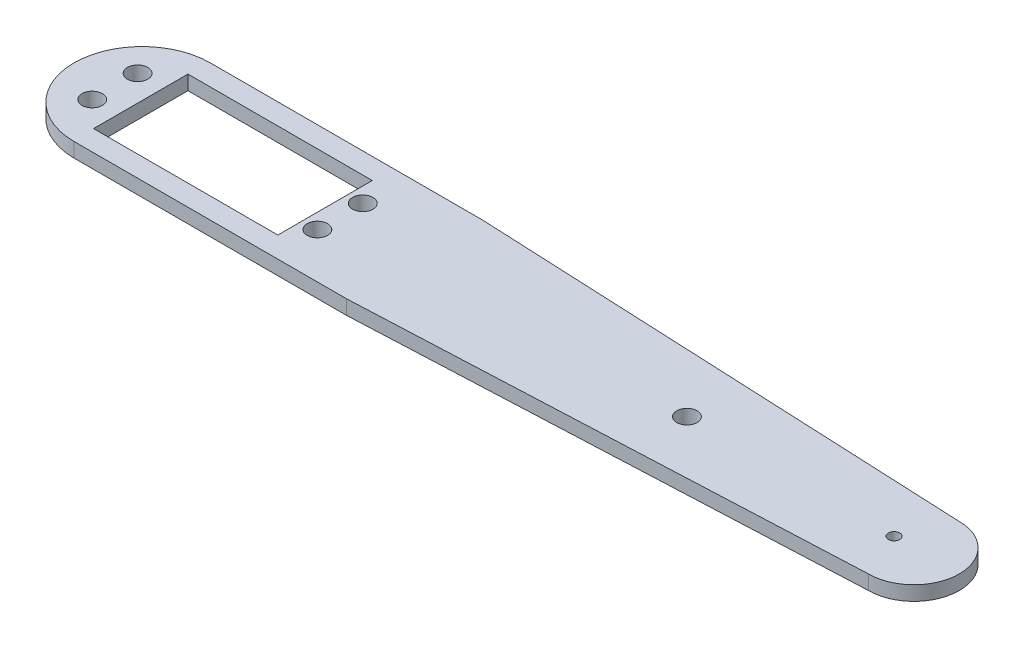
ISO-10303-21;
HEADER;
FILE_DESCRIPTION(('STEP AP214'),'2;1');
FILE_NAME('part.step','',(''),(''),'','','');
FILE_SCHEMA(('AUTOMOTIVE_DESIGN { 1 0 10303 214 1 1 1 1 }'));
ENDSEC;
DATA;
#1=APPLICATION_CONTEXT('core data for automotive mechanical design processes');
#2=APPLICATION_PROTOCOL_DEFINITION('international standard','automotive_design',2000,#1);
#3=PRODUCT_CONTEXT('',#1,'mechanical');
#4=PRODUCT('Part','Part','',(#3));
#5=PRODUCT_RELATED_PRODUCT_CATEGORY('part','',(#4));
#6=PRODUCT_DEFINITION_FORMATION('','',#4);
#7=PRODUCT_DEFINITION_CONTEXT('part definition',#1,'design');
#8=PRODUCT_DEFINITION('design','',#6,#7);
#9=PRODUCT_DEFINITION_SHAPE('','',#8);
#10=(LENGTH_UNIT() NAMED_UNIT(*) SI_UNIT(.MILLI.,.METRE.));
#11=(NAMED_UNIT(*) PLANE_ANGLE_UNIT() SI_UNIT($,.RADIAN.));
#12=(NAMED_UNIT(*) SI_UNIT($,.STERADIAN.) SOLID_ANGLE_UNIT());
#13=UNCERTAINTY_MEASURE_WITH_UNIT(LENGTH_MEASURE(1.E-05),#10,'distance_accuracy_value','');
#14=(GEOMETRIC_REPRESENTATION_CONTEXT(3) GLOBAL_UNCERTAINTY_ASSIGNED_CONTEXT((#13)) GLOBAL_UNIT_ASSIGNED_CONTEXT((#10,
#11,#12)) REPRESENTATION_CONTEXT('',''));
#15=CARTESIAN_POINT('',(0.,0.,0.));
#16=DIRECTION('',(0.,0.,1.));
#17=DIRECTION('',(1.,0.,0.));
#18=AXIS2_PLACEMENT_3D('',#15,#16,#17);
#19=CARTESIAN_POINT('',(-162.387355879804,3.175,-2.24465289077099));
#20=DIRECTION('',(0.,1.,0.));
#21=DIRECTION('',(0.,0.,1.));
#22=AXIS2_PLACEMENT_3D('',#19,#20,#21);
#23=PLANE('',#22);
#24=CARTESIAN_POINT('',(3.23764412020114,3.175,-2.24631068209422));
#25=DIRECTION('',(0.,1.,0.));
#26=DIRECTION('',(0.,0.,1.));
#27=AXIS2_PLACEMENT_3D('',#24,#25,#26);
#28=CIRCLE('',#27,1.25282432983809);
#29=CARTESIAN_POINT('',(3.23764412020114,3.175,-0.993486352256132));
#30=VERTEX_POINT('',#29);
#31=EDGE_CURVE('E283',#30,#30,#28,.T.);
#32=ORIENTED_EDGE('',*,*,#31,.F.);
#33=EDGE_LOOP('',(#32));
#34=FACE_BOUND('',#33,.T.);
#35=CARTESIAN_POINT('',(-118.787355879804,3.175,-7.24465289077099));
#36=DIRECTION('',(0.,1.,0.));
#37=DIRECTION('',(0.,0.,1.));
#38=AXIS2_PLACEMENT_3D('',#35,#36,#37);
#39=CIRCLE('',#38,2.25);
#40=CARTESIAN_POINT('',(-118.787355879804,3.175,-4.994652890771));
#41=VERTEX_POINT('',#40);
#42=EDGE_CURVE('E295',#41,#41,#39,.T.);
#43=ORIENTED_EDGE('',*,*,#42,.F.);
#44=EDGE_LOOP('',(#43));
#45=FACE_BOUND('',#44,.T.);
#46=CARTESIAN_POINT('',(-168.387355879804,3.175,2.75534710922901));
#47=DIRECTION('',(0.,1.,0.));
#48=DIRECTION('',(0.,0.,1.));
#49=AXIS2_PLACEMENT_3D('',#46,#47,#48);
#50=CIRCLE('',#49,2.25000000000001);
#51=CARTESIAN_POINT('',(-168.387355879804,3.175,5.00534710922902));
#52=VERTEX_POINT('',#51);
#53=EDGE_CURVE('E141',#52,#52,#50,.T.);
#54=ORIENTED_EDGE('',*,*,#53,.F.);
#55=EDGE_LOOP('',(#54));
#56=FACE_BOUND('',#55,.T.);
#57=CARTESIAN_POINT('',(-162.387355879804,3.175,-2.24465289077099));
#58=DIRECTION('',(0.,1.,0.));
#59=DIRECTION('',(0.,0.,1.));
#60=AXIS2_PLACEMENT_3D('',#57,#58,#59);
#61=CIRCLE('',#60,15.);
#62=CARTESIAN_POINT('',(-162.387355879804,3.175,-17.244652890771));
#63=VERTEX_POINT('',#62);
#64=CARTESIAN_POINT('',(-162.387355879804,3.175,12.755347109229));
#65=VERTEX_POINT('',#64);
#66=EDGE_CURVE('E151',#63,#65,#61,.T.);
#67=ORIENTED_EDGE('',*,*,#66,.T.);
#68=DIRECTION('',(1.,0.,0.));
#69=VECTOR('',#68,1.);
#70=CARTESIAN_POINT('',(-162.387355879804,3.175,12.755347109229));
#71=LINE('',#70,#69);
#72=CARTESIAN_POINT('',(-102.387355879804,3.175,12.755347109229));
#73=VERTEX_POINT('',#72);
#74=EDGE_CURVE('E154',#65,#73,#71,.T.);
#75=ORIENTED_EDGE('',*,*,#74,.T.);
#76=DIRECTION('',(0.9989685402103,0.,-0.04540766091865));
#77=VECTOR('',#76,1.);
#78=CARTESIAN_POINT('',(-102.387355879804,3.175,12.755347109229));
#79=LINE('',#78,#77);
#80=CARTESIAN_POINT('',(7.61264412019603,3.175,7.75534710922901));
#81=VERTEX_POINT('',#80);
#82=EDGE_CURVE('E157',#73,#81,#79,.T.);
#83=ORIENTED_EDGE('',*,*,#82,.T.);
#84=CARTESIAN_POINT('',(7.61264412019603,3.175,-2.24465289077099));
#85=DIRECTION('',(0.,1.,0.));
#86=DIRECTION('',(0.,0.,1.));
#87=AXIS2_PLACEMENT_3D('',#84,#85,#86);
#88=CIRCLE('',#87,10.);
#89=CARTESIAN_POINT('',(7.61264412019603,3.175,-12.244652890771));
#90=VERTEX_POINT('',#89);
#91=EDGE_CURVE('E159',#81,#90,#88,.T.);
#92=ORIENTED_EDGE('',*,*,#91,.T.);
#93=DIRECTION('',(-0.998968540210299,0.,-0.04540766091865));
#94=VECTOR('',#93,1.);
#95=CARTESIAN_POINT('',(-102.387355879804,3.175,-17.244652890771));
#96=LINE('',#95,#94);
#97=CARTESIAN_POINT('',(-102.387355879804,3.175,-17.244652890771));
#98=VERTEX_POINT('',#97);
#99=EDGE_CURVE('E161',#90,#98,#96,.T.);
#100=ORIENTED_EDGE('',*,*,#99,.T.);
#101=DIRECTION('',(-1.,0.,0.));
#102=VECTOR('',#101,1.);
#103=CARTESIAN_POINT('',(-162.387355879804,3.175,-17.244652890771));
#104=LINE('',#103,#102);
#105=EDGE_CURVE('E163',#98,#63,#104,.T.);
#106=ORIENTED_EDGE('',*,*,#105,.T.);
#107=EDGE_LOOP('',(#67,#75,#83,#92,#100,#106));
#108=FACE_BOUND('',#107,.T.);
#109=DIRECTION('',(1.,0.,0.));
#110=VECTOR('',#109,1.);
#111=CARTESIAN_POINT('',(-162.692621678717,3.175,8.15534710922901));
#112=LINE('',#111,#110);
#113=CARTESIAN_POINT('',(-162.692621678717,3.175,8.15534710922901));
#114=VERTEX_POINT('',#113);
#115=CARTESIAN_POINT('',(-122.092621678717,3.175,8.15534710922901));
#116=VERTEX_POINT('',#115);
#117=EDGE_CURVE('E120',#114,#116,#112,.T.);
#118=ORIENTED_EDGE('',*,*,#117,.F.);
#119=DIRECTION('',(0.,0.,1.));
#120=VECTOR('',#119,1.);
#121=CARTESIAN_POINT('',(-162.692621678717,3.175,8.15534710922901));
#122=LINE('',#121,#120);
#123=CARTESIAN_POINT('',(-162.692621678717,3.175,-12.644652890771));
#124=VERTEX_POINT('',#123);
#125=EDGE_CURVE('E112',#124,#114,#122,.T.);
#126=ORIENTED_EDGE('',*,*,#125,.F.);
#127=DIRECTION('',(-1.,0.,0.));
#128=VECTOR('',#127,1.);
#129=CARTESIAN_POINT('',(-162.692621678717,3.175,-12.644652890771));
#130=LINE('',#129,#128);
#131=CARTESIAN_POINT('',(-122.092621678717,3.175,-12.644652890771));
#132=VERTEX_POINT('',#131);
#133=EDGE_CURVE('E135',#132,#124,#130,.T.);
#134=ORIENTED_EDGE('',*,*,#133,.F.);
#135=DIRECTION('',(0.,0.,-1.));
#136=VECTOR('',#135,1.);
#137=CARTESIAN_POINT('',(-122.092621678717,3.175,8.15534710922901));
#138=LINE('',#137,#136);
#139=EDGE_CURVE('E133',#116,#132,#138,.T.);
#140=ORIENTED_EDGE('',*,*,#139,.F.);
#141=EDGE_LOOP('',(#118,#126,#134,#140));
#142=FACE_BOUND('',#141,.T.);
#143=CARTESIAN_POINT('',(-168.387355879804,3.175,-7.24465289077099));
#144=DIRECTION('',(0.,1.,0.));
#145=DIRECTION('',(0.,0.,1.));
#146=AXIS2_PLACEMENT_3D('',#143,#144,#145);
#147=CIRCLE('',#146,2.25000000000001);
#148=CARTESIAN_POINT('',(-168.387355879804,3.175,-4.99465289077098));
#149=VERTEX_POINT('',#148);
#150=EDGE_CURVE('E301',#149,#149,#147,.T.);
#151=ORIENTED_EDGE('',*,*,#150,.F.);
#152=EDGE_LOOP('',(#151));
#153=FACE_BOUND('',#152,.T.);
#154=CARTESIAN_POINT('',(-118.787355879804,3.175,2.75534710922901));
#155=DIRECTION('',(0.,1.,0.));
#156=DIRECTION('',(0.,0.,1.));
#157=AXIS2_PLACEMENT_3D('',#154,#155,#156);
#158=CIRCLE('',#157,2.25);
#159=CARTESIAN_POINT('',(-118.787355879804,3.175,5.00534710922901));
#160=VERTEX_POINT('',#159);
#161=EDGE_CURVE('E289',#160,#160,#158,.T.);
#162=ORIENTED_EDGE('',*,*,#161,.F.);
#163=EDGE_LOOP('',(#162));
#164=FACE_BOUND('',#163,.T.);
#165=CARTESIAN_POINT('',(-42.387355879804,3.175,-2.24465289077099));
#166=DIRECTION('',(0.,1.,0.));
#167=DIRECTION('',(0.,0.,1.));
#168=AXIS2_PLACEMENT_3D('',#165,#166,#167);
#169=CIRCLE('',#168,2.25);
#170=CARTESIAN_POINT('',(-42.387355879804,3.175,0.00534710922901142));
#171=VERTEX_POINT('',#170);
#172=EDGE_CURVE('E274',#171,#171,#169,.T.);
#173=ORIENTED_EDGE('',*,*,#172,.F.);
#174=EDGE_LOOP('',(#173));
#175=FACE_BOUND('',#174,.T.);
#176=ADVANCED_FACE('F35',(#34,#45,#56,#108,#142,#153,#164,#175),#23,.T.);
#177=CARTESIAN_POINT('',(-162.387355879804,0.,-2.24465289077099));
#178=DIRECTION('',(0.,1.,0.));
#179=DIRECTION('',(0.,0.,1.));
#180=AXIS2_PLACEMENT_3D('',#177,#178,#179);
#181=PLANE('',#180);
#182=CARTESIAN_POINT('',(-162.387355879804,0.,-2.24465289077099));
#183=DIRECTION('',(0.,1.,0.));
#184=DIRECTION('',(0.,0.,1.));
#185=AXIS2_PLACEMENT_3D('',#182,#183,#184);
#186=CIRCLE('',#185,15.);
#187=CARTESIAN_POINT('',(-162.387355879804,0.,-17.244652890771));
#188=VERTEX_POINT('',#187);
#189=CARTESIAN_POINT('',(-162.387355879804,0.,12.755347109229));
#190=VERTEX_POINT('',#189);
#191=EDGE_CURVE('E128',#188,#190,#186,.T.);
#192=ORIENTED_EDGE('',*,*,#191,.F.);
#193=DIRECTION('',(-1.,0.,0.));
#194=VECTOR('',#193,1.);
#195=CARTESIAN_POINT('',(-162.387355879804,0.,-17.244652890771));
#196=LINE('',#195,#194);
#197=CARTESIAN_POINT('',(-102.387355879804,0.,-17.244652890771));
#198=VERTEX_POINT('',#197);
#199=EDGE_CURVE('E155',#198,#188,#196,.T.);
#200=ORIENTED_EDGE('',*,*,#199,.F.);
#201=DIRECTION('',(-0.998968540210299,0.,-0.04540766091865));
#202=VECTOR('',#201,1.);
#203=CARTESIAN_POINT('',(-102.387355879804,0.,-17.244652890771));
#204=LINE('',#203,#202);
#205=CARTESIAN_POINT('',(7.61264412019603,0.,-12.244652890771));
#206=VERTEX_POINT('',#205);
#207=EDGE_CURVE('E174',#206,#198,#204,.T.);
#208=ORIENTED_EDGE('',*,*,#207,.F.);
#209=CARTESIAN_POINT('',(7.61264412019603,0.,-2.24465289077099));
#210=DIRECTION('',(0.,1.,0.));
#211=DIRECTION('',(0.,0.,1.));
#212=AXIS2_PLACEMENT_3D('',#209,#210,#211);
#213=CIRCLE('',#212,10.);
#214=CARTESIAN_POINT('',(7.61264412019603,0.,7.75534710922901));
#215=VERTEX_POINT('',#214);
#216=EDGE_CURVE('E172',#215,#206,#213,.T.);
#217=ORIENTED_EDGE('',*,*,#216,.F.);
#218=DIRECTION('',(0.9989685402103,0.,-0.04540766091865));
#219=VECTOR('',#218,1.);
#220=CARTESIAN_POINT('',(-102.387355879804,0.,12.755347109229));
#221=LINE('',#220,#219);
#222=CARTESIAN_POINT('',(-102.387355879804,0.,12.755347109229));
#223=VERTEX_POINT('',#222);
#224=EDGE_CURVE('E170',#223,#215,#221,.T.);
#225=ORIENTED_EDGE('',*,*,#224,.F.);
#226=DIRECTION('',(1.,0.,0.));
#227=VECTOR('',#226,1.);
#228=CARTESIAN_POINT('',(-162.387355879804,0.,12.755347109229));
#229=LINE('',#228,#227);
#230=EDGE_CURVE('E168',#190,#223,#229,.T.);
#231=ORIENTED_EDGE('',*,*,#230,.F.);
#232=EDGE_LOOP('',(#192,#200,#208,#217,#225,#231));
#233=FACE_BOUND('',#232,.T.);
#234=DIRECTION('',(0.,0.,1.));
#235=VECTOR('',#234,1.);
#236=CARTESIAN_POINT('',(-162.692621678717,0.,8.15534710922901));
#237=LINE('',#236,#235);
#238=CARTESIAN_POINT('',(-162.692621678717,0.,-12.644652890771));
#239=VERTEX_POINT('',#238);
#240=CARTESIAN_POINT('',(-162.692621678717,0.,8.15534710922901));
#241=VERTEX_POINT('',#240);
#242=EDGE_CURVE('E58',#239,#241,#237,.T.);
#243=ORIENTED_EDGE('',*,*,#242,.T.);
#244=DIRECTION('',(1.,0.,0.));
#245=VECTOR('',#244,1.);
#246=CARTESIAN_POINT('',(-162.692621678717,0.,8.15534710922901));
#247=LINE('',#246,#245);
#248=CARTESIAN_POINT('',(-122.092621678717,0.,8.15534710922901));
#249=VERTEX_POINT('',#248);
#250=EDGE_CURVE('E127',#241,#249,#247,.T.);
#251=ORIENTED_EDGE('',*,*,#250,.T.);
#252=DIRECTION('',(0.,0.,-1.));
#253=VECTOR('',#252,1.);
#254=CARTESIAN_POINT('',(-122.092621678717,0.,8.15534710922901));
#255=LINE('',#254,#253);
#256=CARTESIAN_POINT('',(-122.092621678717,0.,-12.644652890771));
#257=VERTEX_POINT('',#256);
#258=EDGE_CURVE('E143',#249,#257,#255,.T.);
#259=ORIENTED_EDGE('',*,*,#258,.T.);
#260=DIRECTION('',(-1.,0.,0.));
#261=VECTOR('',#260,1.);
#262=CARTESIAN_POINT('',(-162.692621678717,0.,-12.644652890771));
#263=LINE('',#262,#261);
#264=EDGE_CURVE('E121',#257,#239,#263,.T.);
#265=ORIENTED_EDGE('',*,*,#264,.T.);
#266=EDGE_LOOP('',(#243,#251,#259,#265));
#267=FACE_BOUND('',#266,.T.);
#268=CARTESIAN_POINT('',(-168.387355879804,0.,2.75534710922901));
#269=DIRECTION('',(0.,1.,0.));
#270=DIRECTION('',(0.,0.,1.));
#271=AXIS2_PLACEMENT_3D('',#268,#269,#270);
#272=CIRCLE('',#271,2.25000000000001);
#273=CARTESIAN_POINT('',(-168.387355879804,0.,5.00534710922902));
#274=VERTEX_POINT('',#273);
#275=EDGE_CURVE('E304',#274,#274,#272,.T.);
#276=ORIENTED_EDGE('',*,*,#275,.T.);
#277=EDGE_LOOP('',(#276));
#278=FACE_BOUND('',#277,.T.);
#279=CARTESIAN_POINT('',(-168.387355879804,0.,-7.24465289077099));
#280=DIRECTION('',(0.,1.,0.));
#281=DIRECTION('',(0.,0.,1.));
#282=AXIS2_PLACEMENT_3D('',#279,#280,#281);
#283=CIRCLE('',#282,2.25000000000001);
#284=CARTESIAN_POINT('',(-168.387355879804,0.,-4.99465289077098));
#285=VERTEX_POINT('',#284);
#286=EDGE_CURVE('E298',#285,#285,#283,.T.);
#287=ORIENTED_EDGE('',*,*,#286,.T.);
#288=EDGE_LOOP('',(#287));
#289=FACE_BOUND('',#288,.T.);
#290=CARTESIAN_POINT('',(-118.787355879804,0.,-7.24465289077099));
#291=DIRECTION('',(0.,1.,0.));
#292=DIRECTION('',(0.,0.,1.));
#293=AXIS2_PLACEMENT_3D('',#290,#291,#292);
#294=CIRCLE('',#293,2.25);
#295=CARTESIAN_POINT('',(-118.787355879804,0.,-4.994652890771));
#296=VERTEX_POINT('',#295);
#297=EDGE_CURVE('E292',#296,#296,#294,.T.);
#298=ORIENTED_EDGE('',*,*,#297,.T.);
#299=EDGE_LOOP('',(#298));
#300=FACE_BOUND('',#299,.T.);
#301=CARTESIAN_POINT('',(-118.787355879804,0.,2.75534710922901));
#302=DIRECTION('',(0.,1.,0.));
#303=DIRECTION('',(0.,0.,1.));
#304=AXIS2_PLACEMENT_3D('',#301,#302,#303);
#305=CIRCLE('',#304,2.25);
#306=CARTESIAN_POINT('',(-118.787355879804,0.,5.00534710922901));
#307=VERTEX_POINT('',#306);
#308=EDGE_CURVE('E286',#307,#307,#305,.T.);
#309=ORIENTED_EDGE('',*,*,#308,.T.);
#310=EDGE_LOOP('',(#309));
#311=FACE_BOUND('',#310,.T.);
#312=CARTESIAN_POINT('',(3.23764412020114,0.,-2.24631068209422));
#313=DIRECTION('',(0.,1.,0.));
#314=DIRECTION('',(0.,0.,1.));
#315=AXIS2_PLACEMENT_3D('',#312,#313,#314);
#316=CIRCLE('',#315,1.25282432983809);
#317=CARTESIAN_POINT('',(3.23764412020114,0.,-0.993486352256132));
#318=VERTEX_POINT('',#317);
#319=EDGE_CURVE('E280',#318,#318,#316,.T.);
#320=ORIENTED_EDGE('',*,*,#319,.T.);
#321=EDGE_LOOP('',(#320));
#322=FACE_BOUND('',#321,.T.);
#323=CARTESIAN_POINT('',(-42.387355879804,0.,-2.24465289077099));
#324=DIRECTION('',(0.,1.,0.));
#325=DIRECTION('',(0.,0.,1.));
#326=AXIS2_PLACEMENT_3D('',#323,#324,#325);
#327=CIRCLE('',#326,2.25);
#328=CARTESIAN_POINT('',(-42.387355879804,0.,0.00534710922901142));
#329=VERTEX_POINT('',#328);
#330=EDGE_CURVE('E277',#329,#329,#327,.T.);
#331=ORIENTED_EDGE('',*,*,#330,.T.);
#332=EDGE_LOOP('',(#331));
#333=FACE_BOUND('',#332,.T.);
#334=ADVANCED_FACE('F198',(#233,#267,#278,#289,#300,#311,#322,#333),#181,.F.);
#335=CARTESIAN_POINT('',(-162.387355879804,3.175,-2.24465289077099));
#336=DIRECTION('',(0.,-1.,0.));
#337=DIRECTION('',(0.,0.,-1.));
#338=AXIS2_PLACEMENT_3D('',#335,#336,#337);
#339=CYLINDRICAL_SURFACE('',#338,15.);
#340=ORIENTED_EDGE('',*,*,#191,.T.);
#341=DIRECTION('',(0.,-1.,0.));
#342=VECTOR('',#341,1.);
#343=CARTESIAN_POINT('',(-162.387355879804,3.175,12.755347109229));
#344=LINE('',#343,#342);
#345=EDGE_CURVE('E11',#65,#190,#344,.T.);
#346=ORIENTED_EDGE('',*,*,#345,.F.);
#347=ORIENTED_EDGE('',*,*,#66,.F.);
#348=DIRECTION('',(0.,-1.,0.));
#349=VECTOR('',#348,1.);
#350=CARTESIAN_POINT('',(-162.387355879804,3.175,-17.244652890771));
#351=LINE('',#350,#349);
#352=EDGE_CURVE('E165',#63,#188,#351,.T.);
#353=ORIENTED_EDGE('',*,*,#352,.T.);
#354=EDGE_LOOP('',(#340,#346,#347,#353));
#355=FACE_BOUND('',#354,.T.);
#356=ADVANCED_FACE('F37',(#355),#339,.T.);
#357=CARTESIAN_POINT('',(-162.387355879804,3.175,12.755347109229));
#358=DIRECTION('',(0.,0.,-1.));
#359=DIRECTION('',(-1.,0.,0.));
#360=AXIS2_PLACEMENT_3D('',#357,#358,#359);
#361=PLANE('',#360);
#362=ORIENTED_EDGE('',*,*,#230,.T.);
#363=DIRECTION('',(0.,-1.,0.));
#364=VECTOR('',#363,1.);
#365=CARTESIAN_POINT('',(-102.387355879804,3.175,12.755347109229));
#366=LINE('',#365,#364);
#367=EDGE_CURVE('E43',#73,#223,#366,.T.);
#368=ORIENTED_EDGE('',*,*,#367,.F.);
#369=ORIENTED_EDGE('',*,*,#74,.F.);
#370=ORIENTED_EDGE('',*,*,#345,.T.);
#371=EDGE_LOOP('',(#362,#368,#369,#370));
#372=FACE_BOUND('',#371,.T.);
#373=ADVANCED_FACE('F215',(#372),#361,.F.);
#374=CARTESIAN_POINT('',(-102.387355879804,3.175,12.755347109229));
#375=DIRECTION('',(-0.04540766091865,0.,-0.9989685402103));
#376=DIRECTION('',(-0.9989685402103,0.,0.04540766091865));
#377=AXIS2_PLACEMENT_3D('',#374,#375,#376);
#378=PLANE('',#377);
#379=ORIENTED_EDGE('',*,*,#224,.T.);
#380=DIRECTION('',(0.,-1.,0.));
#381=VECTOR('',#380,1.);
#382=CARTESIAN_POINT('',(7.61264412019603,3.175,7.75534710922901));
#383=LINE('',#382,#381);
#384=EDGE_CURVE('E185',#81,#215,#383,.T.);
#385=ORIENTED_EDGE('',*,*,#384,.F.);
#386=ORIENTED_EDGE('',*,*,#82,.F.);
#387=ORIENTED_EDGE('',*,*,#367,.T.);
#388=EDGE_LOOP('',(#379,#385,#386,#387));
#389=FACE_BOUND('',#388,.T.);
#390=ADVANCED_FACE('F192',(#389),#378,.F.);
#391=CARTESIAN_POINT('',(7.61264412019603,3.175,-2.24465289077099));
#392=DIRECTION('',(0.,-1.,0.));
#393=DIRECTION('',(0.,0.,-1.));
#394=AXIS2_PLACEMENT_3D('',#391,#392,#393);
#395=CYLINDRICAL_SURFACE('',#394,10.);
#396=ORIENTED_EDGE('',*,*,#216,.T.);
#397=DIRECTION('',(0.,-1.,0.));
#398=VECTOR('',#397,1.);
#399=CARTESIAN_POINT('',(7.61264412019603,3.175,-12.244652890771));
#400=LINE('',#399,#398);
#401=EDGE_CURVE('E182',#90,#206,#400,.T.);
#402=ORIENTED_EDGE('',*,*,#401,.F.);
#403=ORIENTED_EDGE('',*,*,#91,.F.);
#404=ORIENTED_EDGE('',*,*,#384,.T.);
#405=EDGE_LOOP('',(#396,#402,#403,#404));
#406=FACE_BOUND('',#405,.T.);
#407=ADVANCED_FACE('F204',(#406),#395,.T.);
#408=CARTESIAN_POINT('',(-102.387355879804,3.175,-17.244652890771));
#409=DIRECTION('',(-0.04540766091865,0.,0.9989685402103));
#410=DIRECTION('',(0.9989685402103,0.,0.04540766091865));
#411=AXIS2_PLACEMENT_3D('',#408,#409,#410);
#412=PLANE('',#411);
#413=ORIENTED_EDGE('',*,*,#207,.T.);
#414=DIRECTION('',(0.,-1.,0.));
#415=VECTOR('',#414,1.);
#416=CARTESIAN_POINT('',(-102.387355879804,3.175,-17.244652890771));
#417=LINE('',#416,#415);
#418=EDGE_CURVE('E179',#98,#198,#417,.T.);
#419=ORIENTED_EDGE('',*,*,#418,.F.);
#420=ORIENTED_EDGE('',*,*,#99,.F.);
#421=ORIENTED_EDGE('',*,*,#401,.T.);
#422=EDGE_LOOP('',(#413,#419,#420,#421));
#423=FACE_BOUND('',#422,.T.);
#424=ADVANCED_FACE('F208',(#423),#412,.F.);
#425=CARTESIAN_POINT('',(-162.387355879804,3.175,-17.244652890771));
#426=DIRECTION('',(0.,0.,1.));
#427=DIRECTION('',(1.,0.,0.));
#428=AXIS2_PLACEMENT_3D('',#425,#426,#427);
#429=PLANE('',#428);
#430=ORIENTED_EDGE('',*,*,#199,.T.);
#431=ORIENTED_EDGE('',*,*,#352,.F.);
#432=ORIENTED_EDGE('',*,*,#105,.F.);
#433=ORIENTED_EDGE('',*,*,#418,.T.);
#434=EDGE_LOOP('',(#430,#431,#432,#433));
#435=FACE_BOUND('',#434,.T.);
#436=ADVANCED_FACE('F218',(#435),#429,.F.);
#437=CARTESIAN_POINT('',(-162.692621678717,3.175,8.15534710922901));
#438=DIRECTION('',(1.,0.,0.));
#439=DIRECTION('',(0.,0.,-1.));
#440=AXIS2_PLACEMENT_3D('',#437,#438,#439);
#441=PLANE('',#440);
#442=ORIENTED_EDGE('',*,*,#242,.F.);
#443=DIRECTION('',(0.,-1.,0.));
#444=VECTOR('',#443,1.);
#445=CARTESIAN_POINT('',(-162.692621678717,3.175,-12.644652890771));
#446=LINE('',#445,#444);
#447=EDGE_CURVE('E116',#124,#239,#446,.T.);
#448=ORIENTED_EDGE('',*,*,#447,.F.);
#449=ORIENTED_EDGE('',*,*,#125,.T.);
#450=DIRECTION('',(0.,-1.,0.));
#451=VECTOR('',#450,1.);
#452=CARTESIAN_POINT('',(-162.692621678717,3.175,8.15534710922901));
#453=LINE('',#452,#451);
#454=EDGE_CURVE('E115',#114,#241,#453,.T.);
#455=ORIENTED_EDGE('',*,*,#454,.T.);
#456=EDGE_LOOP('',(#442,#448,#449,#455));
#457=FACE_BOUND('',#456,.T.);
#458=ADVANCED_FACE('F114',(#457),#441,.T.);
#459=CARTESIAN_POINT('',(-162.692621678717,3.175,8.15534710922901));
#460=DIRECTION('',(0.,0.,-1.));
#461=DIRECTION('',(-1.,0.,0.));
#462=AXIS2_PLACEMENT_3D('',#459,#460,#461);
#463=PLANE('',#462);
#464=ORIENTED_EDGE('',*,*,#250,.F.);
#465=ORIENTED_EDGE('',*,*,#454,.F.);
#466=ORIENTED_EDGE('',*,*,#117,.T.);
#467=DIRECTION('',(0.,-1.,0.));
#468=VECTOR('',#467,1.);
#469=CARTESIAN_POINT('',(-122.092621678717,3.175,8.15534710922901));
#470=LINE('',#469,#468);
#471=EDGE_CURVE('E129',#116,#249,#470,.T.);
#472=ORIENTED_EDGE('',*,*,#471,.T.);
#473=EDGE_LOOP('',(#464,#465,#466,#472));
#474=FACE_BOUND('',#473,.T.);
#475=ADVANCED_FACE('F124',(#474),#463,.T.);
#476=CARTESIAN_POINT('',(-122.092621678717,3.175,8.15534710922901));
#477=DIRECTION('',(-1.,0.,0.));
#478=DIRECTION('',(0.,0.,1.));
#479=AXIS2_PLACEMENT_3D('',#476,#477,#478);
#480=PLANE('',#479);
#481=ORIENTED_EDGE('',*,*,#258,.F.);
#482=ORIENTED_EDGE('',*,*,#471,.F.);
#483=ORIENTED_EDGE('',*,*,#139,.T.);
#484=DIRECTION('',(0.,-1.,0.));
#485=VECTOR('',#484,1.);
#486=CARTESIAN_POINT('',(-122.092621678717,3.175,-12.644652890771));
#487=LINE('',#486,#485);
#488=EDGE_CURVE('E50',#132,#257,#487,.T.);
#489=ORIENTED_EDGE('',*,*,#488,.T.);
#490=EDGE_LOOP('',(#481,#482,#483,#489));
#491=FACE_BOUND('',#490,.T.);
#492=ADVANCED_FACE('F239',(#491),#480,.T.);
#493=CARTESIAN_POINT('',(-162.692621678717,3.175,-12.644652890771));
#494=DIRECTION('',(0.,0.,1.));
#495=DIRECTION('',(1.,0.,0.));
#496=AXIS2_PLACEMENT_3D('',#493,#494,#495);
#497=PLANE('',#496);
#498=ORIENTED_EDGE('',*,*,#264,.F.);
#499=ORIENTED_EDGE('',*,*,#488,.F.);
#500=ORIENTED_EDGE('',*,*,#133,.T.);
#501=ORIENTED_EDGE('',*,*,#447,.T.);
#502=EDGE_LOOP('',(#498,#499,#500,#501));
#503=FACE_BOUND('',#502,.T.);
#504=ADVANCED_FACE('F242',(#503),#497,.T.);
#505=CARTESIAN_POINT('',(-168.387355879804,3.175,2.75534710922901));
#506=DIRECTION('',(0.,-1.,0.));
#507=DIRECTION('',(0.,0.,-1.));
#508=AXIS2_PLACEMENT_3D('',#505,#506,#507);
#509=CYLINDRICAL_SURFACE('',#508,2.25000000000001);
#510=ORIENTED_EDGE('',*,*,#53,.T.);
#511=EDGE_LOOP('',(#510));
#512=FACE_BOUND('',#511,.T.);
#513=ORIENTED_EDGE('',*,*,#275,.F.);
#514=EDGE_LOOP('',(#513));
#515=FACE_BOUND('',#514,.T.);
#516=ADVANCED_FACE('F246',(#512,#515),#509,.F.);
#517=CARTESIAN_POINT('',(-168.387355879804,3.175,-7.24465289077099));
#518=DIRECTION('',(0.,-1.,0.));
#519=DIRECTION('',(0.,0.,-1.));
#520=AXIS2_PLACEMENT_3D('',#517,#518,#519);
#521=CYLINDRICAL_SURFACE('',#520,2.25000000000001);
#522=ORIENTED_EDGE('',*,*,#150,.T.);
#523=EDGE_LOOP('',(#522));
#524=FACE_BOUND('',#523,.T.);
#525=ORIENTED_EDGE('',*,*,#286,.F.);
#526=EDGE_LOOP('',(#525));
#527=FACE_BOUND('',#526,.T.);
#528=ADVANCED_FACE('F249',(#524,#527),#521,.F.);
#529=CARTESIAN_POINT('',(-118.787355879804,3.175,-7.24465289077099));
#530=DIRECTION('',(0.,-1.,0.));
#531=DIRECTION('',(0.,0.,-1.));
#532=AXIS2_PLACEMENT_3D('',#529,#530,#531);
#533=CYLINDRICAL_SURFACE('',#532,2.25);
#534=ORIENTED_EDGE('',*,*,#42,.T.);
#535=EDGE_LOOP('',(#534));
#536=FACE_BOUND('',#535,.T.);
#537=ORIENTED_EDGE('',*,*,#297,.F.);
#538=EDGE_LOOP('',(#537));
#539=FACE_BOUND('',#538,.T.);
#540=ADVANCED_FACE('F253',(#536,#539),#533,.F.);
#541=CARTESIAN_POINT('',(-118.787355879804,3.175,2.75534710922901));
#542=DIRECTION('',(0.,-1.,0.));
#543=DIRECTION('',(0.,0.,-1.));
#544=AXIS2_PLACEMENT_3D('',#541,#542,#543);
#545=CYLINDRICAL_SURFACE('',#544,2.25);
#546=ORIENTED_EDGE('',*,*,#161,.T.);
#547=EDGE_LOOP('',(#546));
#548=FACE_BOUND('',#547,.T.);
#549=ORIENTED_EDGE('',*,*,#308,.F.);
#550=EDGE_LOOP('',(#549));
#551=FACE_BOUND('',#550,.T.);
#552=ADVANCED_FACE('F257',(#548,#551),#545,.F.);
#553=CARTESIAN_POINT('',(3.23764412020114,3.175,-2.24631068209422));
#554=DIRECTION('',(0.,-1.,0.));
#555=DIRECTION('',(0.,0.,-1.));
#556=AXIS2_PLACEMENT_3D('',#553,#554,#555);
#557=CYLINDRICAL_SURFACE('',#556,1.25282432983809);
#558=ORIENTED_EDGE('',*,*,#31,.T.);
#559=EDGE_LOOP('',(#558));
#560=FACE_BOUND('',#559,.T.);
#561=ORIENTED_EDGE('',*,*,#319,.F.);
#562=EDGE_LOOP('',(#561));
#563=FACE_BOUND('',#562,.T.);
#564=ADVANCED_FACE('F261',(#560,#563),#557,.F.);
#565=CARTESIAN_POINT('',(-42.387355879804,3.175,-2.24465289077099));
#566=DIRECTION('',(0.,-1.,0.));
#567=DIRECTION('',(0.,0.,-1.));
#568=AXIS2_PLACEMENT_3D('',#565,#566,#567);
#569=CYLINDRICAL_SURFACE('',#568,2.25);
#570=ORIENTED_EDGE('',*,*,#172,.T.);
#571=EDGE_LOOP('',(#570));
#572=FACE_BOUND('',#571,.T.);
#573=ORIENTED_EDGE('',*,*,#330,.F.);
#574=EDGE_LOOP('',(#573));
#575=FACE_BOUND('',#574,.T.);
#576=ADVANCED_FACE('F265',(#572,#575),#569,.F.);
#577=CLOSED_SHELL('',(#176,#334,#356,#373,#390,#407,#424,#436,#458,#475,#492,#504,#516,#528,
#540,#552,#564,#576));
#578=MANIFOLD_SOLID_BREP('B2',#577);
#579=ADVANCED_BREP_SHAPE_REPRESENTATION('',(#18,#578),#14);
#580=SHAPE_DEFINITION_REPRESENTATION(#9,#579);
ENDSEC;
END-ISO-10303-21;
